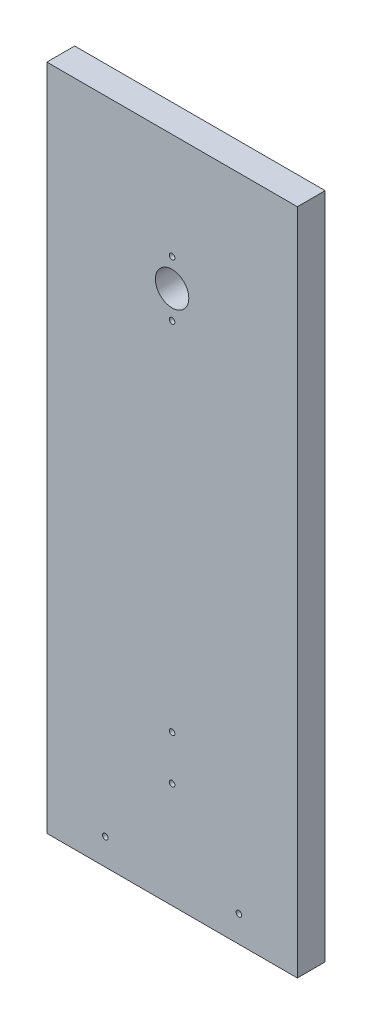
ISO-10303-21;
HEADER;
FILE_DESCRIPTION(('STEP AP214'),'2;1');
FILE_NAME('part.step','',(''),(''),'','','');
FILE_SCHEMA(('AUTOMOTIVE_DESIGN { 1 0 10303 214 1 1 1 1 }'));
ENDSEC;
DATA;
#1=APPLICATION_CONTEXT('core data for automotive mechanical design processes');
#2=APPLICATION_PROTOCOL_DEFINITION('international standard','automotive_design',2000,#1);
#3=PRODUCT_CONTEXT('',#1,'mechanical');
#4=PRODUCT('Part','Part','',(#3));
#5=PRODUCT_RELATED_PRODUCT_CATEGORY('part','',(#4));
#6=PRODUCT_DEFINITION_FORMATION('','',#4);
#7=PRODUCT_DEFINITION_CONTEXT('part definition',#1,'design');
#8=PRODUCT_DEFINITION('design','',#6,#7);
#9=PRODUCT_DEFINITION_SHAPE('','',#8);
#10=(LENGTH_UNIT() NAMED_UNIT(*) SI_UNIT(.MILLI.,.METRE.));
#11=(NAMED_UNIT(*) PLANE_ANGLE_UNIT() SI_UNIT($,.RADIAN.));
#12=(NAMED_UNIT(*) SI_UNIT($,.STERADIAN.) SOLID_ANGLE_UNIT());
#13=UNCERTAINTY_MEASURE_WITH_UNIT(LENGTH_MEASURE(1.E-05),#10,'distance_accuracy_value','');
#14=(GEOMETRIC_REPRESENTATION_CONTEXT(3) GLOBAL_UNCERTAINTY_ASSIGNED_CONTEXT((#13)) GLOBAL_UNIT_ASSIGNED_CONTEXT((#10,
#11,#12)) REPRESENTATION_CONTEXT('',''));
#15=CARTESIAN_POINT('',(0.,0.,0.));
#16=DIRECTION('',(0.,0.,1.));
#17=DIRECTION('',(1.,0.,0.));
#18=AXIS2_PLACEMENT_3D('',#15,#16,#17);
#19=CARTESIAN_POINT('',(0.,0.,10.));
#20=DIRECTION('',(1.,0.,0.));
#21=DIRECTION('',(0.,0.,-1.));
#22=AXIS2_PLACEMENT_3D('',#19,#20,#21);
#23=PLANE('',#22);
#24=DIRECTION('',(0.,-1.,0.));
#25=VECTOR('',#24,1.);
#26=CARTESIAN_POINT('',(0.,0.,0.));
#27=LINE('',#26,#25);
#28=CARTESIAN_POINT('',(0.,240.,0.));
#29=VERTEX_POINT('',#28);
#30=CARTESIAN_POINT('',(0.,0.,0.));
#31=VERTEX_POINT('',#30);
#32=EDGE_CURVE('E96',#29,#31,#27,.T.);
#33=ORIENTED_EDGE('',*,*,#32,.T.);
#34=DIRECTION('',(0.,0.,-1.));
#35=VECTOR('',#34,1.);
#36=CARTESIAN_POINT('',(0.,0.,10.));
#37=LINE('',#36,#35);
#38=CARTESIAN_POINT('',(0.,0.,10.));
#39=VERTEX_POINT('',#38);
#40=EDGE_CURVE('E11',#39,#31,#37,.T.);
#41=ORIENTED_EDGE('',*,*,#40,.F.);
#42=DIRECTION('',(0.,-1.,0.));
#43=VECTOR('',#42,1.);
#44=CARTESIAN_POINT('',(0.,0.,10.));
#45=LINE('',#44,#43);
#46=CARTESIAN_POINT('',(0.,240.,10.));
#47=VERTEX_POINT('',#46);
#48=EDGE_CURVE('E84',#47,#39,#45,.T.);
#49=ORIENTED_EDGE('',*,*,#48,.F.);
#50=DIRECTION('',(0.,0.,-1.));
#51=VECTOR('',#50,1.);
#52=CARTESIAN_POINT('',(0.,240.,10.));
#53=LINE('',#52,#51);
#54=EDGE_CURVE('E92',#47,#29,#53,.T.);
#55=ORIENTED_EDGE('',*,*,#54,.T.);
#56=EDGE_LOOP('',(#33,#41,#49,#55));
#57=FACE_BOUND('',#56,.T.);
#58=ADVANCED_FACE('F33',(#57),#23,.F.);
#59=CARTESIAN_POINT('',(0.,0.,10.));
#60=DIRECTION('',(0.,1.,0.));
#61=DIRECTION('',(0.,0.,1.));
#62=AXIS2_PLACEMENT_3D('',#59,#60,#61);
#63=PLANE('',#62);
#64=DIRECTION('',(1.,0.,0.));
#65=VECTOR('',#64,1.);
#66=CARTESIAN_POINT('',(0.,0.,0.));
#67=LINE('',#66,#65);
#68=CARTESIAN_POINT('',(90.,0.,0.));
#69=VERTEX_POINT('',#68);
#70=EDGE_CURVE('E88',#31,#69,#67,.T.);
#71=ORIENTED_EDGE('',*,*,#70,.T.);
#72=DIRECTION('',(0.,0.,-1.));
#73=VECTOR('',#72,1.);
#74=CARTESIAN_POINT('',(90.,0.,10.));
#75=LINE('',#74,#73);
#76=CARTESIAN_POINT('',(90.,0.,10.));
#77=VERTEX_POINT('',#76);
#78=EDGE_CURVE('E41',#77,#69,#75,.T.);
#79=ORIENTED_EDGE('',*,*,#78,.F.);
#80=DIRECTION('',(1.,0.,0.));
#81=VECTOR('',#80,1.);
#82=CARTESIAN_POINT('',(0.,0.,10.));
#83=LINE('',#82,#81);
#84=EDGE_CURVE('E79',#39,#77,#83,.T.);
#85=ORIENTED_EDGE('',*,*,#84,.F.);
#86=ORIENTED_EDGE('',*,*,#40,.T.);
#87=EDGE_LOOP('',(#71,#79,#85,#86));
#88=FACE_BOUND('',#87,.T.);
#89=ADVANCED_FACE('F87',(#88),#63,.F.);
#90=CARTESIAN_POINT('',(90.,0.,10.));
#91=DIRECTION('',(-1.,0.,0.));
#92=DIRECTION('',(0.,0.,1.));
#93=AXIS2_PLACEMENT_3D('',#90,#91,#92);
#94=PLANE('',#93);
#95=DIRECTION('',(0.,1.,0.));
#96=VECTOR('',#95,1.);
#97=CARTESIAN_POINT('',(90.,0.,0.));
#98=LINE('',#97,#96);
#99=CARTESIAN_POINT('',(90.,240.,0.));
#100=VERTEX_POINT('',#99);
#101=EDGE_CURVE('E66',#69,#100,#98,.T.);
#102=ORIENTED_EDGE('',*,*,#101,.T.);
#103=DIRECTION('',(0.,0.,-1.));
#104=VECTOR('',#103,1.);
#105=CARTESIAN_POINT('',(90.,240.,10.));
#106=LINE('',#105,#104);
#107=CARTESIAN_POINT('',(90.,240.,10.));
#108=VERTEX_POINT('',#107);
#109=EDGE_CURVE('E89',#108,#100,#106,.T.);
#110=ORIENTED_EDGE('',*,*,#109,.F.);
#111=DIRECTION('',(0.,1.,0.));
#112=VECTOR('',#111,1.);
#113=CARTESIAN_POINT('',(90.,0.,10.));
#114=LINE('',#113,#112);
#115=EDGE_CURVE('E82',#77,#108,#114,.T.);
#116=ORIENTED_EDGE('',*,*,#115,.F.);
#117=ORIENTED_EDGE('',*,*,#78,.T.);
#118=EDGE_LOOP('',(#102,#110,#116,#117));
#119=FACE_BOUND('',#118,.T.);
#120=ADVANCED_FACE('F90',(#119),#94,.F.);
#121=CARTESIAN_POINT('',(0.,240.,10.));
#122=DIRECTION('',(0.,-1.,0.));
#123=DIRECTION('',(0.,0.,-1.));
#124=AXIS2_PLACEMENT_3D('',#121,#122,#123);
#125=PLANE('',#124);
#126=DIRECTION('',(-1.,0.,0.));
#127=VECTOR('',#126,1.);
#128=CARTESIAN_POINT('',(0.,240.,0.));
#129=LINE('',#128,#127);
#130=EDGE_CURVE('E72',#100,#29,#129,.T.);
#131=ORIENTED_EDGE('',*,*,#130,.T.);
#132=ORIENTED_EDGE('',*,*,#54,.F.);
#133=DIRECTION('',(-1.,0.,0.));
#134=VECTOR('',#133,1.);
#135=CARTESIAN_POINT('',(0.,240.,10.));
#136=LINE('',#135,#134);
#137=EDGE_CURVE('E49',#108,#47,#136,.T.);
#138=ORIENTED_EDGE('',*,*,#137,.F.);
#139=ORIENTED_EDGE('',*,*,#109,.T.);
#140=EDGE_LOOP('',(#131,#132,#138,#139));
#141=FACE_BOUND('',#140,.T.);
#142=ADVANCED_FACE('F104',(#141),#125,.F.);
#143=CARTESIAN_POINT('',(0.,0.,10.));
#144=DIRECTION('',(0.,0.,-1.));
#145=DIRECTION('',(-1.,0.,0.));
#146=AXIS2_PLACEMENT_3D('',#143,#144,#145);
#147=PLANE('',#146);
#148=CARTESIAN_POINT('',(45.,192.,10.));
#149=DIRECTION('',(0.,0.,-1.));
#150=DIRECTION('',(-1.,0.,0.));
#151=AXIS2_PLACEMENT_3D('',#148,#149,#150);
#152=CIRCLE('',#151,6.);
#153=CARTESIAN_POINT('',(39.,192.,10.));
#154=VERTEX_POINT('',#153);
#155=EDGE_CURVE('E99',#154,#154,#152,.T.);
#156=ORIENTED_EDGE('',*,*,#155,.T.);
#157=EDGE_LOOP('',(#156));
#158=FACE_BOUND('',#157,.T.);
#159=CARTESIAN_POINT('',(69.,9.50000000000001,10.));
#160=DIRECTION('',(0.,0.,-1.));
#161=DIRECTION('',(-1.,0.,0.));
#162=AXIS2_PLACEMENT_3D('',#159,#160,#161);
#163=CIRCLE('',#162,0.999999999999998);
#164=CARTESIAN_POINT('',(68.,9.50000000000001,10.));
#165=VERTEX_POINT('',#164);
#166=EDGE_CURVE('E112',#165,#165,#163,.T.);
#167=ORIENTED_EDGE('',*,*,#166,.T.);
#168=EDGE_LOOP('',(#167));
#169=FACE_BOUND('',#168,.T.);
#170=CARTESIAN_POINT('',(21.,9.50000000000001,10.));
#171=DIRECTION('',(0.,0.,-1.));
#172=DIRECTION('',(-1.,0.,0.));
#173=AXIS2_PLACEMENT_3D('',#170,#171,#172);
#174=CIRCLE('',#173,1.);
#175=CARTESIAN_POINT('',(20.,9.50000000000001,10.));
#176=VERTEX_POINT('',#175);
#177=EDGE_CURVE('E115',#176,#176,#174,.T.);
#178=ORIENTED_EDGE('',*,*,#177,.T.);
#179=EDGE_LOOP('',(#178));
#180=FACE_BOUND('',#179,.T.);
#181=CARTESIAN_POINT('',(45.,38.,10.));
#182=DIRECTION('',(0.,0.,-1.));
#183=DIRECTION('',(-1.,0.,0.));
#184=AXIS2_PLACEMENT_3D('',#181,#182,#183);
#185=CIRCLE('',#184,0.999999999999998);
#186=CARTESIAN_POINT('',(44.,38.,10.));
#187=VERTEX_POINT('',#186);
#188=EDGE_CURVE('E118',#187,#187,#185,.T.);
#189=ORIENTED_EDGE('',*,*,#188,.T.);
#190=EDGE_LOOP('',(#189));
#191=FACE_BOUND('',#190,.T.);
#192=CARTESIAN_POINT('',(45.,182.,10.));
#193=DIRECTION('',(0.,0.,-1.));
#194=DIRECTION('',(-1.,0.,0.));
#195=AXIS2_PLACEMENT_3D('',#192,#193,#194);
#196=CIRCLE('',#195,0.999999999999998);
#197=CARTESIAN_POINT('',(44.,182.,10.));
#198=VERTEX_POINT('',#197);
#199=EDGE_CURVE('E121',#198,#198,#196,.T.);
#200=ORIENTED_EDGE('',*,*,#199,.T.);
#201=EDGE_LOOP('',(#200));
#202=FACE_BOUND('',#201,.T.);
#203=CARTESIAN_POINT('',(45.,202.,10.));
#204=DIRECTION('',(0.,0.,-1.));
#205=DIRECTION('',(-1.,0.,0.));
#206=AXIS2_PLACEMENT_3D('',#203,#204,#205);
#207=CIRCLE('',#206,0.999999999999998);
#208=CARTESIAN_POINT('',(44.,202.,10.));
#209=VERTEX_POINT('',#208);
#210=EDGE_CURVE('E124',#209,#209,#207,.T.);
#211=ORIENTED_EDGE('',*,*,#210,.T.);
#212=EDGE_LOOP('',(#211));
#213=FACE_BOUND('',#212,.T.);
#214=CARTESIAN_POINT('',(45.,54.,10.));
#215=DIRECTION('',(0.,0.,-1.));
#216=DIRECTION('',(-1.,0.,0.));
#217=AXIS2_PLACEMENT_3D('',#214,#215,#216);
#218=CIRCLE('',#217,0.999999999999998);
#219=CARTESIAN_POINT('',(44.,54.,10.));
#220=VERTEX_POINT('',#219);
#221=EDGE_CURVE('E127',#220,#220,#218,.T.);
#222=ORIENTED_EDGE('',*,*,#221,.T.);
#223=EDGE_LOOP('',(#222));
#224=FACE_BOUND('',#223,.T.);
#225=ORIENTED_EDGE('',*,*,#48,.T.);
#226=ORIENTED_EDGE('',*,*,#84,.T.);
#227=ORIENTED_EDGE('',*,*,#115,.T.);
#228=ORIENTED_EDGE('',*,*,#137,.T.);
#229=EDGE_LOOP('',(#225,#226,#227,#228));
#230=FACE_BOUND('',#229,.T.);
#231=ADVANCED_FACE('F80',(#158,#169,#180,#191,#202,#213,#224,#230),#147,.F.);
#232=CARTESIAN_POINT('',(0.,0.,0.));
#233=DIRECTION('',(0.,0.,-1.));
#234=DIRECTION('',(-1.,0.,0.));
#235=AXIS2_PLACEMENT_3D('',#232,#233,#234);
#236=PLANE('',#235);
#237=CARTESIAN_POINT('',(45.,192.,0.));
#238=DIRECTION('',(0.,0.,1.));
#239=DIRECTION('',(1.,0.,0.));
#240=AXIS2_PLACEMENT_3D('',#237,#238,#239);
#241=CIRCLE('',#240,6.);
#242=CARTESIAN_POINT('',(51.,192.,0.));
#243=VERTEX_POINT('',#242);
#244=EDGE_CURVE('E140',#243,#243,#241,.T.);
#245=ORIENTED_EDGE('',*,*,#244,.T.);
#246=EDGE_LOOP('',(#245));
#247=FACE_BOUND('',#246,.T.);
#248=CARTESIAN_POINT('',(69.,9.50000000000001,0.));
#249=DIRECTION('',(0.,0.,1.));
#250=DIRECTION('',(-1.,0.,0.));
#251=AXIS2_PLACEMENT_3D('',#248,#249,#250);
#252=CIRCLE('',#251,0.999999999999998);
#253=CARTESIAN_POINT('',(68.,9.50000000000001,0.));
#254=VERTEX_POINT('',#253);
#255=EDGE_CURVE('E137',#254,#254,#252,.T.);
#256=ORIENTED_EDGE('',*,*,#255,.T.);
#257=EDGE_LOOP('',(#256));
#258=FACE_BOUND('',#257,.T.);
#259=CARTESIAN_POINT('',(21.,9.50000000000001,0.));
#260=DIRECTION('',(0.,0.,1.));
#261=DIRECTION('',(1.,0.,0.));
#262=AXIS2_PLACEMENT_3D('',#259,#260,#261);
#263=CIRCLE('',#262,1.);
#264=CARTESIAN_POINT('',(22.,9.50000000000001,0.));
#265=VERTEX_POINT('',#264);
#266=EDGE_CURVE('E134',#265,#265,#263,.T.);
#267=ORIENTED_EDGE('',*,*,#266,.T.);
#268=EDGE_LOOP('',(#267));
#269=FACE_BOUND('',#268,.T.);
#270=CARTESIAN_POINT('',(45.,38.,0.));
#271=DIRECTION('',(0.,0.,1.));
#272=DIRECTION('',(1.,0.,0.));
#273=AXIS2_PLACEMENT_3D('',#270,#271,#272);
#274=CIRCLE('',#273,0.999999999999998);
#275=CARTESIAN_POINT('',(46.,38.,0.));
#276=VERTEX_POINT('',#275);
#277=EDGE_CURVE('E133',#276,#276,#274,.T.);
#278=ORIENTED_EDGE('',*,*,#277,.T.);
#279=EDGE_LOOP('',(#278));
#280=FACE_BOUND('',#279,.T.);
#281=CARTESIAN_POINT('',(45.,182.,0.));
#282=DIRECTION('',(0.,0.,1.));
#283=DIRECTION('',(1.,0.,0.));
#284=AXIS2_PLACEMENT_3D('',#281,#282,#283);
#285=CIRCLE('',#284,0.999999999999998);
#286=CARTESIAN_POINT('',(46.,182.,0.));
#287=VERTEX_POINT('',#286);
#288=EDGE_CURVE('E143',#287,#287,#285,.T.);
#289=ORIENTED_EDGE('',*,*,#288,.T.);
#290=EDGE_LOOP('',(#289));
#291=FACE_BOUND('',#290,.T.);
#292=CARTESIAN_POINT('',(45.,202.,0.));
#293=DIRECTION('',(0.,0.,1.));
#294=DIRECTION('',(-1.,0.,0.));
#295=AXIS2_PLACEMENT_3D('',#292,#293,#294);
#296=CIRCLE('',#295,0.999999999999998);
#297=CARTESIAN_POINT('',(44.,202.,0.));
#298=VERTEX_POINT('',#297);
#299=EDGE_CURVE('E146',#298,#298,#296,.T.);
#300=ORIENTED_EDGE('',*,*,#299,.T.);
#301=EDGE_LOOP('',(#300));
#302=FACE_BOUND('',#301,.T.);
#303=CARTESIAN_POINT('',(45.,54.,0.));
#304=DIRECTION('',(0.,0.,1.));
#305=DIRECTION('',(1.,0.,0.));
#306=AXIS2_PLACEMENT_3D('',#303,#304,#305);
#307=CIRCLE('',#306,0.999999999999998);
#308=CARTESIAN_POINT('',(46.,54.,0.));
#309=VERTEX_POINT('',#308);
#310=EDGE_CURVE('E130',#309,#309,#307,.T.);
#311=ORIENTED_EDGE('',*,*,#310,.T.);
#312=EDGE_LOOP('',(#311));
#313=FACE_BOUND('',#312,.T.);
#314=ORIENTED_EDGE('',*,*,#32,.F.);
#315=ORIENTED_EDGE('',*,*,#130,.F.);
#316=ORIENTED_EDGE('',*,*,#101,.F.);
#317=ORIENTED_EDGE('',*,*,#70,.F.);
#318=EDGE_LOOP('',(#314,#315,#316,#317));
#319=FACE_BOUND('',#318,.T.);
#320=ADVANCED_FACE('F107',(#247,#258,#269,#280,#291,#302,#313,#319),#236,.T.);
#321=CARTESIAN_POINT('',(45.,54.,0.));
#322=DIRECTION('',(0.,0.,1.));
#323=DIRECTION('',(1.,0.,0.));
#324=AXIS2_PLACEMENT_3D('',#321,#322,#323);
#325=CYLINDRICAL_SURFACE('',#324,0.999999999999998);
#326=ORIENTED_EDGE('',*,*,#310,.F.);
#327=EDGE_LOOP('',(#326));
#328=FACE_BOUND('',#327,.T.);
#329=ORIENTED_EDGE('',*,*,#221,.F.);
#330=EDGE_LOOP('',(#329));
#331=FACE_BOUND('',#330,.T.);
#332=ADVANCED_FACE('F170',(#328,#331),#325,.F.);
#333=CARTESIAN_POINT('',(45.,202.,0.));
#334=DIRECTION('',(0.,0.,1.));
#335=DIRECTION('',(1.,0.,0.));
#336=AXIS2_PLACEMENT_3D('',#333,#334,#335);
#337=CYLINDRICAL_SURFACE('',#336,0.999999999999998);
#338=ORIENTED_EDGE('',*,*,#299,.F.);
#339=EDGE_LOOP('',(#338));
#340=FACE_BOUND('',#339,.T.);
#341=ORIENTED_EDGE('',*,*,#210,.F.);
#342=EDGE_LOOP('',(#341));
#343=FACE_BOUND('',#342,.T.);
#344=ADVANCED_FACE('F158',(#340,#343),#337,.F.);
#345=CARTESIAN_POINT('',(45.,182.,0.));
#346=DIRECTION('',(0.,0.,1.));
#347=DIRECTION('',(1.,0.,0.));
#348=AXIS2_PLACEMENT_3D('',#345,#346,#347);
#349=CYLINDRICAL_SURFACE('',#348,0.999999999999998);
#350=ORIENTED_EDGE('',*,*,#288,.F.);
#351=EDGE_LOOP('',(#350));
#352=FACE_BOUND('',#351,.T.);
#353=ORIENTED_EDGE('',*,*,#199,.F.);
#354=EDGE_LOOP('',(#353));
#355=FACE_BOUND('',#354,.T.);
#356=ADVANCED_FACE('F154',(#352,#355),#349,.F.);
#357=CARTESIAN_POINT('',(45.,38.,0.));
#358=DIRECTION('',(0.,0.,1.));
#359=DIRECTION('',(1.,0.,0.));
#360=AXIS2_PLACEMENT_3D('',#357,#358,#359);
#361=CYLINDRICAL_SURFACE('',#360,0.999999999999998);
#362=ORIENTED_EDGE('',*,*,#277,.F.);
#363=EDGE_LOOP('',(#362));
#364=FACE_BOUND('',#363,.T.);
#365=ORIENTED_EDGE('',*,*,#188,.F.);
#366=EDGE_LOOP('',(#365));
#367=FACE_BOUND('',#366,.T.);
#368=ADVANCED_FACE('F157',(#364,#367),#361,.F.);
#369=CARTESIAN_POINT('',(21.,9.50000000000001,0.));
#370=DIRECTION('',(0.,0.,1.));
#371=DIRECTION('',(1.,0.,0.));
#372=AXIS2_PLACEMENT_3D('',#369,#370,#371);
#373=CYLINDRICAL_SURFACE('',#372,1.);
#374=ORIENTED_EDGE('',*,*,#266,.F.);
#375=EDGE_LOOP('',(#374));
#376=FACE_BOUND('',#375,.T.);
#377=ORIENTED_EDGE('',*,*,#177,.F.);
#378=EDGE_LOOP('',(#377));
#379=FACE_BOUND('',#378,.T.);
#380=ADVANCED_FACE('F233',(#376,#379),#373,.F.);
#381=CARTESIAN_POINT('',(69.,9.50000000000001,0.));
#382=DIRECTION('',(0.,0.,1.));
#383=DIRECTION('',(1.,0.,0.));
#384=AXIS2_PLACEMENT_3D('',#381,#382,#383);
#385=CYLINDRICAL_SURFACE('',#384,0.999999999999998);
#386=ORIENTED_EDGE('',*,*,#255,.F.);
#387=EDGE_LOOP('',(#386));
#388=FACE_BOUND('',#387,.T.);
#389=ORIENTED_EDGE('',*,*,#166,.F.);
#390=EDGE_LOOP('',(#389));
#391=FACE_BOUND('',#390,.T.);
#392=ADVANCED_FACE('F243',(#388,#391),#385,.F.);
#393=CARTESIAN_POINT('',(45.,192.,0.));
#394=DIRECTION('',(0.,0.,1.));
#395=DIRECTION('',(1.,0.,0.));
#396=AXIS2_PLACEMENT_3D('',#393,#394,#395);
#397=CYLINDRICAL_SURFACE('',#396,6.);
#398=ORIENTED_EDGE('',*,*,#244,.F.);
#399=EDGE_LOOP('',(#398));
#400=FACE_BOUND('',#399,.T.);
#401=ORIENTED_EDGE('',*,*,#155,.F.);
#402=EDGE_LOOP('',(#401));
#403=FACE_BOUND('',#402,.T.);
#404=ADVANCED_FACE('F252',(#400,#403),#397,.F.);
#405=CLOSED_SHELL('',(#58,#89,#120,#142,#231,#320,#332,#344,#356,#368,#380,#392,#404));
#406=MANIFOLD_SOLID_BREP('B2',#405);
#407=ADVANCED_BREP_SHAPE_REPRESENTATION('',(#18,#406),#14);
#408=SHAPE_DEFINITION_REPRESENTATION(#9,#407);
ENDSEC;
END-ISO-10303-21;
